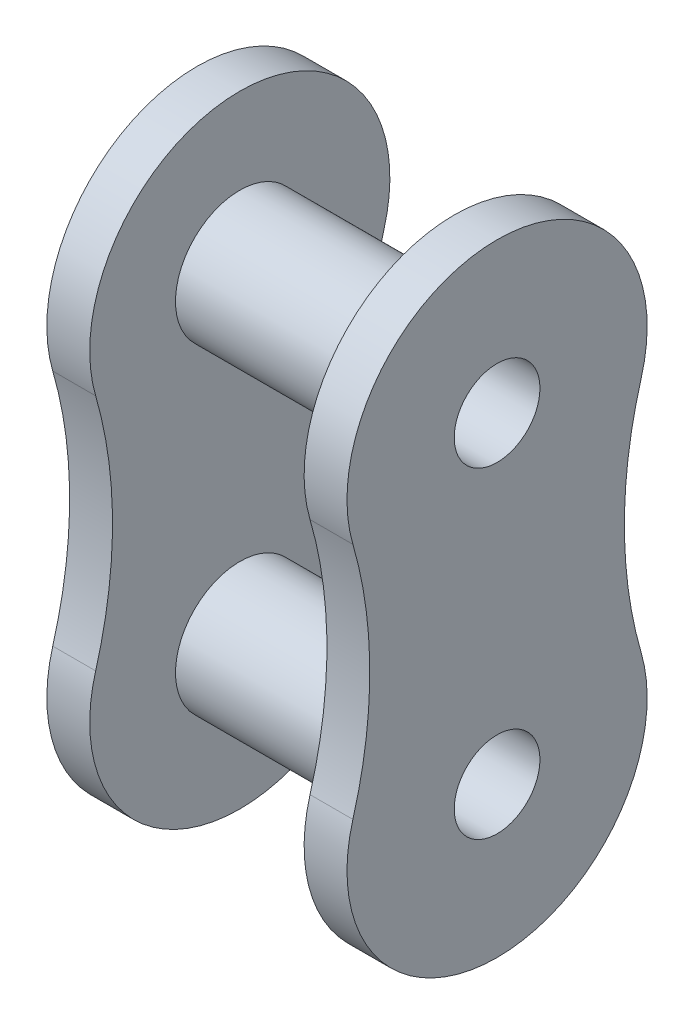
ISO-10303-21;
HEADER;
FILE_DESCRIPTION(('STEP AP214'),'2;1');
FILE_NAME('part.step','',(''),(''),'','','');
FILE_SCHEMA(('AUTOMOTIVE_DESIGN { 1 0 10303 214 1 1 1 1 }'));
ENDSEC;
DATA;
#1=APPLICATION_CONTEXT('core data for automotive mechanical design processes');
#2=APPLICATION_PROTOCOL_DEFINITION('international standard','automotive_design',2000,#1);
#3=PRODUCT_CONTEXT('',#1,'mechanical');
#4=PRODUCT('Part','Part','',(#3));
#5=PRODUCT_RELATED_PRODUCT_CATEGORY('part','',(#4));
#6=PRODUCT_DEFINITION_FORMATION('','',#4);
#7=PRODUCT_DEFINITION_CONTEXT('part definition',#1,'design');
#8=PRODUCT_DEFINITION('design','',#6,#7);
#9=PRODUCT_DEFINITION_SHAPE('','',#8);
#10=(LENGTH_UNIT() NAMED_UNIT(*) SI_UNIT(.MILLI.,.METRE.));
#11=(NAMED_UNIT(*) PLANE_ANGLE_UNIT() SI_UNIT($,.RADIAN.));
#12=(NAMED_UNIT(*) SI_UNIT($,.STERADIAN.) SOLID_ANGLE_UNIT());
#13=UNCERTAINTY_MEASURE_WITH_UNIT(LENGTH_MEASURE(1.E-05),#10,'distance_accuracy_value','');
#14=(GEOMETRIC_REPRESENTATION_CONTEXT(3) GLOBAL_UNCERTAINTY_ASSIGNED_CONTEXT((#13)) GLOBAL_UNIT_ASSIGNED_CONTEXT((#10,
#11,#12)) REPRESENTATION_CONTEXT('',''));
#15=CARTESIAN_POINT('',(0.,0.,0.));
#16=DIRECTION('',(0.,0.,1.));
#17=DIRECTION('',(1.,0.,0.));
#18=AXIS2_PLACEMENT_3D('',#15,#16,#17);
#19=CARTESIAN_POINT('',(-1.,3.75,0.));
#20=DIRECTION('',(1.,0.,0.));
#21=DIRECTION('',(0.,0.,-1.));
#22=AXIS2_PLACEMENT_3D('',#19,#20,#21);
#23=CYLINDRICAL_SURFACE('',#22,3.5);
#24=CARTESIAN_POINT('',(0.,3.75,0.));
#25=DIRECTION('',(1.,0.,0.));
#26=DIRECTION('',(0.,0.,-1.));
#27=AXIS2_PLACEMENT_3D('',#24,#25,#26);
#28=CIRCLE('',#27,3.5);
#29=CARTESIAN_POINT('',(0.,2.77777777777778,3.36225875723706));
#30=VERTEX_POINT('',#29);
#31=CARTESIAN_POINT('',(0.,2.77777777777778,-3.36225875723706));
#32=VERTEX_POINT('',#31);
#33=EDGE_CURVE('E207',#30,#32,#28,.F.);
#34=ORIENTED_EDGE('',*,*,#33,.T.);
#35=DIRECTION('',(1.,0.,0.));
#36=VECTOR('',#35,1.);
#37=CARTESIAN_POINT('',(-1.,2.77777777777778,-3.36225875723706));
#38=LINE('',#37,#36);
#39=CARTESIAN_POINT('',(-1.,2.77777777777778,-3.36225875723706));
#40=VERTEX_POINT('',#39);
#41=EDGE_CURVE('E124',#40,#32,#38,.T.);
#42=ORIENTED_EDGE('',*,*,#41,.F.);
#43=CARTESIAN_POINT('',(-1.,3.75,0.));
#44=DIRECTION('',(1.,0.,0.));
#45=DIRECTION('',(0.,0.,-1.));
#46=AXIS2_PLACEMENT_3D('',#43,#44,#45);
#47=CIRCLE('',#46,3.5);
#48=CARTESIAN_POINT('',(-1.,2.77777777777778,3.36225875723706));
#49=VERTEX_POINT('',#48);
#50=EDGE_CURVE('E98',#49,#40,#47,.F.);
#51=ORIENTED_EDGE('',*,*,#50,.F.);
#52=DIRECTION('',(1.,0.,0.));
#53=VECTOR('',#52,1.);
#54=CARTESIAN_POINT('',(-1.,2.77777777777778,3.36225875723706));
#55=LINE('',#54,#53);
#56=EDGE_CURVE('E208',#49,#30,#55,.T.);
#57=ORIENTED_EDGE('',*,*,#56,.T.);
#58=EDGE_LOOP('',(#34,#42,#51,#57));
#59=FACE_BOUND('',#58,.T.);
#60=ADVANCED_FACE('F78',(#59),#23,.T.);
#61=CARTESIAN_POINT('',(-1.,0.,-12.9687123493429));
#62=DIRECTION('',(1.,0.,0.));
#63=DIRECTION('',(0.,0.,-1.));
#64=AXIS2_PLACEMENT_3D('',#61,#62,#63);
#65=CYLINDRICAL_SURFACE('',#64,10.);
#66=CARTESIAN_POINT('',(0.,0.,-12.9687123493429));
#67=DIRECTION('',(1.,0.,0.));
#68=DIRECTION('',(0.,0.,-1.));
#69=AXIS2_PLACEMENT_3D('',#66,#67,#68);
#70=CIRCLE('',#69,10.);
#71=CARTESIAN_POINT('',(0.,-2.77777777777778,-3.36225875723706));
#72=VERTEX_POINT('',#71);
#73=EDGE_CURVE('E203',#72,#32,#70,.F.);
#74=ORIENTED_EDGE('',*,*,#73,.F.);
#75=DIRECTION('',(1.,0.,0.));
#76=VECTOR('',#75,1.);
#77=CARTESIAN_POINT('',(-1.,-2.77777777777778,-3.36225875723706));
#78=LINE('',#77,#76);
#79=CARTESIAN_POINT('',(-1.,-2.77777777777778,-3.36225875723706));
#80=VERTEX_POINT('',#79);
#81=EDGE_CURVE('E116',#80,#72,#78,.T.);
#82=ORIENTED_EDGE('',*,*,#81,.F.);
#83=CARTESIAN_POINT('',(-1.,0.,-12.9687123493429));
#84=DIRECTION('',(1.,0.,0.));
#85=DIRECTION('',(0.,0.,-1.));
#86=AXIS2_PLACEMENT_3D('',#83,#84,#85);
#87=CIRCLE('',#86,10.);
#88=EDGE_CURVE('E201',#80,#40,#87,.F.);
#89=ORIENTED_EDGE('',*,*,#88,.T.);
#90=ORIENTED_EDGE('',*,*,#41,.T.);
#91=EDGE_LOOP('',(#74,#82,#89,#90));
#92=FACE_BOUND('',#91,.T.);
#93=ADVANCED_FACE('F228',(#92),#65,.F.);
#94=CARTESIAN_POINT('',(-1.,0.,12.9687123493429));
#95=DIRECTION('',(1.,0.,0.));
#96=DIRECTION('',(0.,0.,-1.));
#97=AXIS2_PLACEMENT_3D('',#94,#95,#96);
#98=CYLINDRICAL_SURFACE('',#97,10.);
#99=CARTESIAN_POINT('',(0.,0.,12.9687123493429));
#100=DIRECTION('',(1.,0.,0.));
#101=DIRECTION('',(0.,0.,-1.));
#102=AXIS2_PLACEMENT_3D('',#99,#100,#101);
#103=CIRCLE('',#102,10.);
#104=CARTESIAN_POINT('',(0.,-2.77777777777778,3.36225875723706));
#105=VERTEX_POINT('',#104);
#106=EDGE_CURVE('E211',#105,#30,#103,.T.);
#107=ORIENTED_EDGE('',*,*,#106,.T.);
#108=ORIENTED_EDGE('',*,*,#56,.F.);
#109=CARTESIAN_POINT('',(-1.,0.,12.9687123493429));
#110=DIRECTION('',(1.,0.,0.));
#111=DIRECTION('',(0.,0.,-1.));
#112=AXIS2_PLACEMENT_3D('',#109,#110,#111);
#113=CIRCLE('',#112,10.);
#114=CARTESIAN_POINT('',(-1.,-2.77777777777778,3.36225875723706));
#115=VERTEX_POINT('',#114);
#116=EDGE_CURVE('E126',#115,#49,#113,.T.);
#117=ORIENTED_EDGE('',*,*,#116,.F.);
#118=DIRECTION('',(1.,0.,0.));
#119=VECTOR('',#118,1.);
#120=CARTESIAN_POINT('',(-1.,-2.77777777777778,3.36225875723706));
#121=LINE('',#120,#119);
#122=EDGE_CURVE('E217',#115,#105,#121,.T.);
#123=ORIENTED_EDGE('',*,*,#122,.T.);
#124=EDGE_LOOP('',(#107,#108,#117,#123));
#125=FACE_BOUND('',#124,.T.);
#126=ADVANCED_FACE('F234',(#125),#98,.F.);
#127=CARTESIAN_POINT('',(-1.,3.75,0.));
#128=DIRECTION('',(1.,0.,0.));
#129=DIRECTION('',(0.,0.,-1.));
#130=AXIS2_PLACEMENT_3D('',#127,#128,#129);
#131=CYLINDRICAL_SURFACE('',#130,1.);
#132=CARTESIAN_POINT('',(-1.,3.75,0.));
#133=DIRECTION('',(1.,0.,0.));
#134=DIRECTION('',(0.,0.,-1.));
#135=AXIS2_PLACEMENT_3D('',#132,#133,#134);
#136=CIRCLE('',#135,1.);
#137=CARTESIAN_POINT('',(-1.,3.75,-1.));
#138=VERTEX_POINT('',#137);
#139=EDGE_CURVE('E202',#138,#138,#136,.F.);
#140=ORIENTED_EDGE('',*,*,#139,.T.);
#141=EDGE_LOOP('',(#140));
#142=FACE_BOUND('',#141,.T.);
#143=CARTESIAN_POINT('',(6.,3.75,0.));
#144=DIRECTION('',(1.,0.,0.));
#145=DIRECTION('',(0.,0.,-1.));
#146=AXIS2_PLACEMENT_3D('',#143,#144,#145);
#147=CIRCLE('',#146,1.);
#148=CARTESIAN_POINT('',(6.,3.75,-1.));
#149=VERTEX_POINT('',#148);
#150=EDGE_CURVE('E181',#149,#149,#147,.F.);
#151=ORIENTED_EDGE('',*,*,#150,.F.);
#152=EDGE_LOOP('',(#151));
#153=FACE_BOUND('',#152,.T.);
#154=ADVANCED_FACE('F260',(#142,#153),#131,.F.);
#155=CARTESIAN_POINT('',(-1.,0.,0.));
#156=DIRECTION('',(1.,0.,0.));
#157=DIRECTION('',(0.,0.,-1.));
#158=AXIS2_PLACEMENT_3D('',#155,#156,#157);
#159=PLANE('',#158);
#160=ORIENTED_EDGE('',*,*,#50,.T.);
#161=ORIENTED_EDGE('',*,*,#88,.F.);
#162=CARTESIAN_POINT('',(-1.,-3.75,0.));
#163=DIRECTION('',(1.,0.,0.));
#164=DIRECTION('',(0.,0.,-1.));
#165=AXIS2_PLACEMENT_3D('',#162,#163,#164);
#166=CIRCLE('',#165,3.5);
#167=EDGE_CURVE('E215',#115,#80,#166,.T.);
#168=ORIENTED_EDGE('',*,*,#167,.F.);
#169=ORIENTED_EDGE('',*,*,#116,.T.);
#170=EDGE_LOOP('',(#160,#161,#168,#169));
#171=FACE_BOUND('',#170,.T.);
#172=ORIENTED_EDGE('',*,*,#139,.F.);
#173=EDGE_LOOP('',(#172));
#174=FACE_BOUND('',#173,.T.);
#175=CARTESIAN_POINT('',(-1.,-3.75,0.));
#176=DIRECTION('',(1.,0.,0.));
#177=DIRECTION('',(0.,0.,-1.));
#178=AXIS2_PLACEMENT_3D('',#175,#176,#177);
#179=CIRCLE('',#178,1.);
#180=CARTESIAN_POINT('',(-1.,-3.75,-1.));
#181=VERTEX_POINT('',#180);
#182=EDGE_CURVE('E225',#181,#181,#179,.T.);
#183=ORIENTED_EDGE('',*,*,#182,.T.);
#184=EDGE_LOOP('',(#183));
#185=FACE_BOUND('',#184,.T.);
#186=ADVANCED_FACE('F229',(#171,#174,#185),#159,.F.);
#187=CARTESIAN_POINT('',(0.,0.,0.));
#188=DIRECTION('',(1.,0.,0.));
#189=DIRECTION('',(0.,0.,-1.));
#190=AXIS2_PLACEMENT_3D('',#187,#188,#189);
#191=PLANE('',#190);
#192=CARTESIAN_POINT('',(0.,-3.75,0.));
#193=DIRECTION('',(1.,0.,0.));
#194=DIRECTION('',(0.,0.,-1.));
#195=AXIS2_PLACEMENT_3D('',#192,#193,#194);
#196=CIRCLE('',#195,1.5);
#197=CARTESIAN_POINT('',(0.,-3.75,-1.5));
#198=VERTEX_POINT('',#197);
#199=EDGE_CURVE('E12',#198,#198,#196,.T.);
#200=ORIENTED_EDGE('',*,*,#199,.F.);
#201=EDGE_LOOP('',(#200));
#202=FACE_BOUND('',#201,.T.);
#203=CARTESIAN_POINT('',(0.,3.75,0.));
#204=DIRECTION('',(1.,0.,0.));
#205=DIRECTION('',(0.,0.,-1.));
#206=AXIS2_PLACEMENT_3D('',#203,#204,#205);
#207=CIRCLE('',#206,1.5);
#208=CARTESIAN_POINT('',(0.,3.75,-1.5));
#209=VERTEX_POINT('',#208);
#210=EDGE_CURVE('E90',#209,#209,#207,.T.);
#211=ORIENTED_EDGE('',*,*,#210,.F.);
#212=EDGE_LOOP('',(#211));
#213=FACE_BOUND('',#212,.T.);
#214=ORIENTED_EDGE('',*,*,#33,.F.);
#215=ORIENTED_EDGE('',*,*,#106,.F.);
#216=CARTESIAN_POINT('',(0.,-3.75,0.));
#217=DIRECTION('',(1.,0.,0.));
#218=DIRECTION('',(0.,0.,-1.));
#219=AXIS2_PLACEMENT_3D('',#216,#217,#218);
#220=CIRCLE('',#219,3.5);
#221=EDGE_CURVE('E82',#105,#72,#220,.T.);
#222=ORIENTED_EDGE('',*,*,#221,.T.);
#223=ORIENTED_EDGE('',*,*,#73,.T.);
#224=EDGE_LOOP('',(#214,#215,#222,#223));
#225=FACE_BOUND('',#224,.T.);
#226=ADVANCED_FACE('F227',(#202,#213,#225),#191,.T.);
#227=CARTESIAN_POINT('',(-1.,-3.75,0.));
#228=DIRECTION('',(1.,0.,0.));
#229=DIRECTION('',(0.,0.,-1.));
#230=AXIS2_PLACEMENT_3D('',#227,#228,#229);
#231=CYLINDRICAL_SURFACE('',#230,3.5);
#232=ORIENTED_EDGE('',*,*,#167,.T.);
#233=ORIENTED_EDGE('',*,*,#81,.T.);
#234=ORIENTED_EDGE('',*,*,#221,.F.);
#235=ORIENTED_EDGE('',*,*,#122,.F.);
#236=EDGE_LOOP('',(#232,#233,#234,#235));
#237=FACE_BOUND('',#236,.T.);
#238=ADVANCED_FACE('F83',(#237),#231,.T.);
#239=CARTESIAN_POINT('',(-1.,-3.75,0.));
#240=DIRECTION('',(1.,0.,0.));
#241=DIRECTION('',(0.,0.,-1.));
#242=AXIS2_PLACEMENT_3D('',#239,#240,#241);
#243=CYLINDRICAL_SURFACE('',#242,1.);
#244=ORIENTED_EDGE('',*,*,#182,.F.);
#245=EDGE_LOOP('',(#244));
#246=FACE_BOUND('',#245,.T.);
#247=CARTESIAN_POINT('',(6.,-3.75,0.));
#248=DIRECTION('',(1.,0.,0.));
#249=DIRECTION('',(0.,0.,-1.));
#250=AXIS2_PLACEMENT_3D('',#247,#248,#249);
#251=CIRCLE('',#250,1.);
#252=CARTESIAN_POINT('',(6.,-3.75,-1.));
#253=VERTEX_POINT('',#252);
#254=EDGE_CURVE('E193',#253,#253,#251,.T.);
#255=ORIENTED_EDGE('',*,*,#254,.T.);
#256=EDGE_LOOP('',(#255));
#257=FACE_BOUND('',#256,.T.);
#258=ADVANCED_FACE('F240',(#246,#257),#243,.F.);
#259=CARTESIAN_POINT('',(2.5,3.75,0.));
#260=DIRECTION('',(-1.,0.,0.));
#261=DIRECTION('',(0.,0.,1.));
#262=AXIS2_PLACEMENT_3D('',#259,#260,#261);
#263=CYLINDRICAL_SURFACE('',#262,1.5);
#264=ORIENTED_EDGE('',*,*,#210,.T.);
#265=EDGE_LOOP('',(#264));
#266=FACE_BOUND('',#265,.T.);
#267=CARTESIAN_POINT('',(5.,3.75,0.));
#268=DIRECTION('',(1.,0.,0.));
#269=DIRECTION('',(0.,0.,-1.));
#270=AXIS2_PLACEMENT_3D('',#267,#268,#269);
#271=CIRCLE('',#270,1.5);
#272=CARTESIAN_POINT('',(5.,3.75,-1.5));
#273=VERTEX_POINT('',#272);
#274=EDGE_CURVE('E442',#273,#273,#271,.T.);
#275=ORIENTED_EDGE('',*,*,#274,.F.);
#276=EDGE_LOOP('',(#275));
#277=FACE_BOUND('',#276,.T.);
#278=ADVANCED_FACE('F248',(#266,#277),#263,.T.);
#279=CARTESIAN_POINT('',(2.5,-3.75,0.));
#280=DIRECTION('',(-1.,0.,0.));
#281=DIRECTION('',(0.,0.,1.));
#282=AXIS2_PLACEMENT_3D('',#279,#280,#281);
#283=CYLINDRICAL_SURFACE('',#282,1.5);
#284=ORIENTED_EDGE('',*,*,#199,.T.);
#285=EDGE_LOOP('',(#284));
#286=FACE_BOUND('',#285,.T.);
#287=CARTESIAN_POINT('',(5.,-3.75,0.));
#288=DIRECTION('',(1.,0.,0.));
#289=DIRECTION('',(0.,0.,-1.));
#290=AXIS2_PLACEMENT_3D('',#287,#288,#289);
#291=CIRCLE('',#290,1.5);
#292=CARTESIAN_POINT('',(5.,-3.75,-1.5));
#293=VERTEX_POINT('',#292);
#294=EDGE_CURVE('E221',#293,#293,#291,.T.);
#295=ORIENTED_EDGE('',*,*,#294,.F.);
#296=EDGE_LOOP('',(#295));
#297=FACE_BOUND('',#296,.T.);
#298=ADVANCED_FACE('F263',(#286,#297),#283,.T.);
#299=CARTESIAN_POINT('',(6.,3.75,0.));
#300=DIRECTION('',(-1.,0.,0.));
#301=DIRECTION('',(0.,0.,-1.));
#302=AXIS2_PLACEMENT_3D('',#299,#300,#301);
#303=CYLINDRICAL_SURFACE('',#302,3.5);
#304=CARTESIAN_POINT('',(5.,3.75,0.));
#305=DIRECTION('',(1.,0.,0.));
#306=DIRECTION('',(0.,0.,-1.));
#307=AXIS2_PLACEMENT_3D('',#304,#305,#306);
#308=CIRCLE('',#307,3.5);
#309=CARTESIAN_POINT('',(5.,2.77777777777778,3.36225875723706));
#310=VERTEX_POINT('',#309);
#311=CARTESIAN_POINT('',(5.,2.77777777777778,-3.36225875723706));
#312=VERTEX_POINT('',#311);
#313=EDGE_CURVE('E185',#310,#312,#308,.F.);
#314=ORIENTED_EDGE('',*,*,#313,.F.);
#315=DIRECTION('',(-1.,0.,0.));
#316=VECTOR('',#315,1.);
#317=CARTESIAN_POINT('',(6.,2.77777777777778,3.36225875723706));
#318=LINE('',#317,#316);
#319=CARTESIAN_POINT('',(6.,2.77777777777778,3.36225875723706));
#320=VERTEX_POINT('',#319);
#321=EDGE_CURVE('E162',#320,#310,#318,.T.);
#322=ORIENTED_EDGE('',*,*,#321,.F.);
#323=CARTESIAN_POINT('',(6.,3.75,0.));
#324=DIRECTION('',(1.,0.,0.));
#325=DIRECTION('',(0.,0.,-1.));
#326=AXIS2_PLACEMENT_3D('',#323,#324,#325);
#327=CIRCLE('',#326,3.5);
#328=CARTESIAN_POINT('',(6.,2.77777777777778,-3.36225875723706));
#329=VERTEX_POINT('',#328);
#330=EDGE_CURVE('E166',#320,#329,#327,.F.);
#331=ORIENTED_EDGE('',*,*,#330,.T.);
#332=DIRECTION('',(-1.,0.,0.));
#333=VECTOR('',#332,1.);
#334=CARTESIAN_POINT('',(6.,2.77777777777778,-3.36225875723706));
#335=LINE('',#334,#333);
#336=EDGE_CURVE('E448',#329,#312,#335,.T.);
#337=ORIENTED_EDGE('',*,*,#336,.T.);
#338=EDGE_LOOP('',(#314,#322,#331,#337));
#339=FACE_BOUND('',#338,.T.);
#340=ADVANCED_FACE('F180',(#339),#303,.T.);
#341=CARTESIAN_POINT('',(6.,0.,-12.9687123493429));
#342=DIRECTION('',(-1.,0.,0.));
#343=DIRECTION('',(0.,0.,-1.));
#344=AXIS2_PLACEMENT_3D('',#341,#342,#343);
#345=CYLINDRICAL_SURFACE('',#344,10.);
#346=CARTESIAN_POINT('',(5.,0.,-12.9687123493429));
#347=DIRECTION('',(1.,0.,0.));
#348=DIRECTION('',(0.,0.,-1.));
#349=AXIS2_PLACEMENT_3D('',#346,#347,#348);
#350=CIRCLE('',#349,10.);
#351=CARTESIAN_POINT('',(5.,-2.77777777777778,-3.36225875723706));
#352=VERTEX_POINT('',#351);
#353=EDGE_CURVE('E179',#352,#312,#350,.F.);
#354=ORIENTED_EDGE('',*,*,#353,.T.);
#355=ORIENTED_EDGE('',*,*,#336,.F.);
#356=CARTESIAN_POINT('',(6.,0.,-12.9687123493429));
#357=DIRECTION('',(1.,0.,0.));
#358=DIRECTION('',(0.,0.,-1.));
#359=AXIS2_PLACEMENT_3D('',#356,#357,#358);
#360=CIRCLE('',#359,10.);
#361=CARTESIAN_POINT('',(6.,-2.77777777777778,-3.36225875723706));
#362=VERTEX_POINT('',#361);
#363=EDGE_CURVE('E169',#362,#329,#360,.F.);
#364=ORIENTED_EDGE('',*,*,#363,.F.);
#365=DIRECTION('',(-1.,0.,0.));
#366=VECTOR('',#365,1.);
#367=CARTESIAN_POINT('',(6.,-2.77777777777778,-3.36225875723706));
#368=LINE('',#367,#366);
#369=EDGE_CURVE('E183',#362,#352,#368,.T.);
#370=ORIENTED_EDGE('',*,*,#369,.T.);
#371=EDGE_LOOP('',(#354,#355,#364,#370));
#372=FACE_BOUND('',#371,.T.);
#373=ADVANCED_FACE('F278',(#372),#345,.F.);
#374=CARTESIAN_POINT('',(6.,0.,12.9687123493429));
#375=DIRECTION('',(-1.,0.,0.));
#376=DIRECTION('',(0.,0.,-1.));
#377=AXIS2_PLACEMENT_3D('',#374,#375,#376);
#378=CYLINDRICAL_SURFACE('',#377,10.);
#379=CARTESIAN_POINT('',(5.,0.,12.9687123493429));
#380=DIRECTION('',(1.,0.,0.));
#381=DIRECTION('',(0.,0.,-1.));
#382=AXIS2_PLACEMENT_3D('',#379,#380,#381);
#383=CIRCLE('',#382,10.);
#384=CARTESIAN_POINT('',(5.,-2.77777777777778,3.36225875723706));
#385=VERTEX_POINT('',#384);
#386=EDGE_CURVE('E444',#385,#310,#383,.T.);
#387=ORIENTED_EDGE('',*,*,#386,.F.);
#388=DIRECTION('',(-1.,0.,0.));
#389=VECTOR('',#388,1.);
#390=CARTESIAN_POINT('',(6.,-2.77777777777778,3.36225875723706));
#391=LINE('',#390,#389);
#392=CARTESIAN_POINT('',(6.,-2.77777777777778,3.36225875723706));
#393=VERTEX_POINT('',#392);
#394=EDGE_CURVE('E167',#393,#385,#391,.T.);
#395=ORIENTED_EDGE('',*,*,#394,.F.);
#396=CARTESIAN_POINT('',(6.,0.,12.9687123493429));
#397=DIRECTION('',(1.,0.,0.));
#398=DIRECTION('',(0.,0.,-1.));
#399=AXIS2_PLACEMENT_3D('',#396,#397,#398);
#400=CIRCLE('',#399,10.);
#401=EDGE_CURVE('E158',#393,#320,#400,.T.);
#402=ORIENTED_EDGE('',*,*,#401,.T.);
#403=ORIENTED_EDGE('',*,*,#321,.T.);
#404=EDGE_LOOP('',(#387,#395,#402,#403));
#405=FACE_BOUND('',#404,.T.);
#406=ADVANCED_FACE('F161',(#405),#378,.F.);
#407=CARTESIAN_POINT('',(6.,0.,0.));
#408=DIRECTION('',(-1.,0.,0.));
#409=DIRECTION('',(0.,0.,-1.));
#410=AXIS2_PLACEMENT_3D('',#407,#408,#409);
#411=PLANE('',#410);
#412=ORIENTED_EDGE('',*,*,#330,.F.);
#413=ORIENTED_EDGE('',*,*,#401,.F.);
#414=CARTESIAN_POINT('',(6.,-3.75,0.));
#415=DIRECTION('',(1.,0.,0.));
#416=DIRECTION('',(0.,0.,-1.));
#417=AXIS2_PLACEMENT_3D('',#414,#415,#416);
#418=CIRCLE('',#417,3.5);
#419=EDGE_CURVE('E191',#393,#362,#418,.T.);
#420=ORIENTED_EDGE('',*,*,#419,.T.);
#421=ORIENTED_EDGE('',*,*,#363,.T.);
#422=EDGE_LOOP('',(#412,#413,#420,#421));
#423=FACE_BOUND('',#422,.T.);
#424=ORIENTED_EDGE('',*,*,#150,.T.);
#425=EDGE_LOOP('',(#424));
#426=FACE_BOUND('',#425,.T.);
#427=ORIENTED_EDGE('',*,*,#254,.F.);
#428=EDGE_LOOP('',(#427));
#429=FACE_BOUND('',#428,.T.);
#430=ADVANCED_FACE('F175',(#423,#426,#429),#411,.F.);
#431=CARTESIAN_POINT('',(5.,0.,0.));
#432=DIRECTION('',(-1.,0.,0.));
#433=DIRECTION('',(0.,0.,-1.));
#434=AXIS2_PLACEMENT_3D('',#431,#432,#433);
#435=PLANE('',#434);
#436=ORIENTED_EDGE('',*,*,#294,.T.);
#437=EDGE_LOOP('',(#436));
#438=FACE_BOUND('',#437,.T.);
#439=ORIENTED_EDGE('',*,*,#274,.T.);
#440=EDGE_LOOP('',(#439));
#441=FACE_BOUND('',#440,.T.);
#442=ORIENTED_EDGE('',*,*,#313,.T.);
#443=ORIENTED_EDGE('',*,*,#353,.F.);
#444=CARTESIAN_POINT('',(5.,-3.75,0.));
#445=DIRECTION('',(1.,0.,0.));
#446=DIRECTION('',(0.,0.,-1.));
#447=AXIS2_PLACEMENT_3D('',#444,#445,#446);
#448=CIRCLE('',#447,3.5);
#449=EDGE_CURVE('E195',#385,#352,#448,.T.);
#450=ORIENTED_EDGE('',*,*,#449,.F.);
#451=ORIENTED_EDGE('',*,*,#386,.T.);
#452=EDGE_LOOP('',(#442,#443,#450,#451));
#453=FACE_BOUND('',#452,.T.);
#454=ADVANCED_FACE('F277',(#438,#441,#453),#435,.T.);
#455=CARTESIAN_POINT('',(6.,-3.75,0.));
#456=DIRECTION('',(-1.,0.,0.));
#457=DIRECTION('',(0.,0.,-1.));
#458=AXIS2_PLACEMENT_3D('',#455,#456,#457);
#459=CYLINDRICAL_SURFACE('',#458,3.5);
#460=ORIENTED_EDGE('',*,*,#419,.F.);
#461=ORIENTED_EDGE('',*,*,#394,.T.);
#462=ORIENTED_EDGE('',*,*,#449,.T.);
#463=ORIENTED_EDGE('',*,*,#369,.F.);
#464=EDGE_LOOP('',(#460,#461,#462,#463));
#465=FACE_BOUND('',#464,.T.);
#466=ADVANCED_FACE('F272',(#465),#459,.T.);
#467=CLOSED_SHELL('',(#60,#93,#126,#154,#186,#226,#238,#258,#278,#298,#340,#373,#406,#430,#454,#466));
#468=MANIFOLD_SOLID_BREP('B2',#467);
#469=ADVANCED_BREP_SHAPE_REPRESENTATION('',(#18,#468),#14);
#470=SHAPE_DEFINITION_REPRESENTATION(#9,#469);
ENDSEC;
END-ISO-10303-21;
